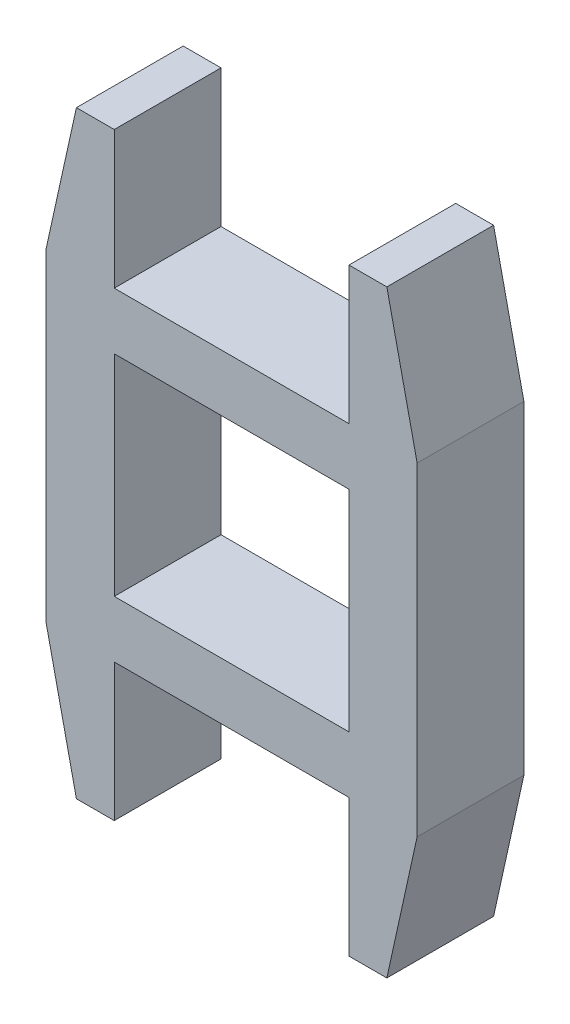
ISO-10303-21;
HEADER;
FILE_DESCRIPTION(('STEP AP214'),'2;1');
FILE_NAME('part.step','',(''),(''),'','','');
FILE_SCHEMA(('AUTOMOTIVE_DESIGN { 1 0 10303 214 1 1 1 1 }'));
ENDSEC;
DATA;
#1=APPLICATION_CONTEXT('core data for automotive mechanical design processes');
#2=APPLICATION_PROTOCOL_DEFINITION('international standard','automotive_design',2000,#1);
#3=PRODUCT_CONTEXT('',#1,'mechanical');
#4=PRODUCT('Part','Part','',(#3));
#5=PRODUCT_RELATED_PRODUCT_CATEGORY('part','',(#4));
#6=PRODUCT_DEFINITION_FORMATION('','',#4);
#7=PRODUCT_DEFINITION_CONTEXT('part definition',#1,'design');
#8=PRODUCT_DEFINITION('design','',#6,#7);
#9=PRODUCT_DEFINITION_SHAPE('','',#8);
#10=(LENGTH_UNIT() NAMED_UNIT(*) SI_UNIT(.MILLI.,.METRE.));
#11=(NAMED_UNIT(*) PLANE_ANGLE_UNIT() SI_UNIT($,.RADIAN.));
#12=(NAMED_UNIT(*) SI_UNIT($,.STERADIAN.) SOLID_ANGLE_UNIT());
#13=UNCERTAINTY_MEASURE_WITH_UNIT(LENGTH_MEASURE(1.E-05),#10,'distance_accuracy_value','');
#14=(GEOMETRIC_REPRESENTATION_CONTEXT(3) GLOBAL_UNCERTAINTY_ASSIGNED_CONTEXT((#13)) GLOBAL_UNIT_ASSIGNED_CONTEXT((#10,
#11,#12)) REPRESENTATION_CONTEXT('',''));
#15=CARTESIAN_POINT('',(0.,0.,0.));
#16=DIRECTION('',(0.,0.,1.));
#17=DIRECTION('',(1.,0.,0.));
#18=AXIS2_PLACEMENT_3D('',#15,#16,#17);
#19=CARTESIAN_POINT('',(1247.20962355286,947.327195660845,5.64));
#20=DIRECTION('',(0.,0.,1.));
#21=DIRECTION('',(1.,0.,0.));
#22=AXIS2_PLACEMENT_3D('',#19,#20,#21);
#23=PLANE('',#22);
#24=DIRECTION('',(0.,1.,0.));
#25=VECTOR('',#24,1.);
#26=CARTESIAN_POINT('',(1247.20962355286,940.068029887523,5.64));
#27=LINE('',#26,#25);
#28=CARTESIAN_POINT('',(1247.20962355286,940.068029887523,5.64));
#29=VERTEX_POINT('',#28);
#30=CARTESIAN_POINT('',(1247.20962355286,947.327195660845,5.64));
#31=VERTEX_POINT('',#30);
#32=EDGE_CURVE('E206',#29,#31,#27,.T.);
#33=ORIENTED_EDGE('',*,*,#32,.T.);
#34=DIRECTION('',(1.,0.,0.));
#35=VECTOR('',#34,1.);
#36=CARTESIAN_POINT('',(1259.60962355286,947.327195660845,5.64));
#37=LINE('',#36,#35);
#38=CARTESIAN_POINT('',(1259.60962355286,947.327195660845,5.64));
#39=VERTEX_POINT('',#38);
#40=EDGE_CURVE('E209',#31,#39,#37,.T.);
#41=ORIENTED_EDGE('',*,*,#40,.T.);
#42=DIRECTION('',(0.,-1.,0.));
#43=VECTOR('',#42,1.);
#44=CARTESIAN_POINT('',(1259.60962355286,940.068029887523,5.64));
#45=LINE('',#44,#43);
#46=CARTESIAN_POINT('',(1259.60962355286,940.068029887523,5.64));
#47=VERTEX_POINT('',#46);
#48=EDGE_CURVE('E212',#39,#47,#45,.T.);
#49=ORIENTED_EDGE('',*,*,#48,.T.);
#50=DIRECTION('',(1.,0.,0.));
#51=VECTOR('',#50,1.);
#52=CARTESIAN_POINT('',(1261.60962355286,940.068029887523,5.64));
#53=LINE('',#52,#51);
#54=CARTESIAN_POINT('',(1261.60962355286,940.068029887523,5.64));
#55=VERTEX_POINT('',#54);
#56=EDGE_CURVE('E214',#47,#55,#53,.T.);
#57=ORIENTED_EDGE('',*,*,#56,.T.);
#58=DIRECTION('',(0.215244604723381,0.976560167187601,0.));
#59=VECTOR('',#58,1.);
#60=CARTESIAN_POINT('',(1263.20962355286,947.327195660845,5.64));
#61=LINE('',#60,#59);
#62=CARTESIAN_POINT('',(1263.20962355286,947.327195660845,5.64));
#63=VERTEX_POINT('',#62);
#64=EDGE_CURVE('E216',#55,#63,#61,.T.);
#65=ORIENTED_EDGE('',*,*,#64,.T.);
#66=DIRECTION('',(0.,1.,0.));
#67=VECTOR('',#66,1.);
#68=CARTESIAN_POINT('',(1263.20962355286,964.427195660845,5.64));
#69=LINE('',#68,#67);
#70=CARTESIAN_POINT('',(1263.20962355286,964.427195660845,5.64));
#71=VERTEX_POINT('',#70);
#72=EDGE_CURVE('E218',#63,#71,#69,.T.);
#73=ORIENTED_EDGE('',*,*,#72,.T.);
#74=DIRECTION('',(-0.215244604723381,0.976560167187601,0.));
#75=VECTOR('',#74,1.);
#76=CARTESIAN_POINT('',(1263.20962355286,964.427195660845,5.64));
#77=LINE('',#76,#75);
#78=CARTESIAN_POINT('',(1261.60962355286,971.686361434167,5.64));
#79=VERTEX_POINT('',#78);
#80=EDGE_CURVE('E220',#71,#79,#77,.T.);
#81=ORIENTED_EDGE('',*,*,#80,.T.);
#82=DIRECTION('',(-1.,0.,0.));
#83=VECTOR('',#82,1.);
#84=CARTESIAN_POINT('',(1261.60962355286,971.686361434167,5.64));
#85=LINE('',#84,#83);
#86=CARTESIAN_POINT('',(1259.60962355286,971.686361434167,5.64));
#87=VERTEX_POINT('',#86);
#88=EDGE_CURVE('E222',#79,#87,#85,.T.);
#89=ORIENTED_EDGE('',*,*,#88,.T.);
#90=DIRECTION('',(0.,-1.,0.));
#91=VECTOR('',#90,1.);
#92=CARTESIAN_POINT('',(1259.60962355286,971.686361434167,5.64));
#93=LINE('',#92,#91);
#94=CARTESIAN_POINT('',(1259.60962355286,964.427195660845,5.64));
#95=VERTEX_POINT('',#94);
#96=EDGE_CURVE('E224',#87,#95,#93,.T.);
#97=ORIENTED_EDGE('',*,*,#96,.T.);
#98=DIRECTION('',(-1.,0.,0.));
#99=VECTOR('',#98,1.);
#100=CARTESIAN_POINT('',(1259.60962355286,964.427195660845,5.64));
#101=LINE('',#100,#99);
#102=CARTESIAN_POINT('',(1247.20962355286,964.427195660845,5.64));
#103=VERTEX_POINT('',#102);
#104=EDGE_CURVE('E226',#95,#103,#101,.T.);
#105=ORIENTED_EDGE('',*,*,#104,.T.);
#106=DIRECTION('',(0.,1.,0.));
#107=VECTOR('',#106,1.);
#108=CARTESIAN_POINT('',(1247.20962355286,971.686361434167,5.64));
#109=LINE('',#108,#107);
#110=CARTESIAN_POINT('',(1247.20962355286,971.686361434167,5.64));
#111=VERTEX_POINT('',#110);
#112=EDGE_CURVE('E228',#103,#111,#109,.T.);
#113=ORIENTED_EDGE('',*,*,#112,.T.);
#114=DIRECTION('',(-1.,0.,0.));
#115=VECTOR('',#114,1.);
#116=CARTESIAN_POINT('',(1245.20962355286,971.686361434167,5.64));
#117=LINE('',#116,#115);
#118=CARTESIAN_POINT('',(1245.20962355286,971.686361434167,5.64));
#119=VERTEX_POINT('',#118);
#120=EDGE_CURVE('E230',#111,#119,#117,.T.);
#121=ORIENTED_EDGE('',*,*,#120,.T.);
#122=DIRECTION('',(-0.215244604723381,-0.976560167187601,0.));
#123=VECTOR('',#122,1.);
#124=CARTESIAN_POINT('',(1243.60962355286,964.427195660845,5.64));
#125=LINE('',#124,#123);
#126=CARTESIAN_POINT('',(1243.60962355286,964.427195660845,5.64));
#127=VERTEX_POINT('',#126);
#128=EDGE_CURVE('E232',#119,#127,#125,.T.);
#129=ORIENTED_EDGE('',*,*,#128,.T.);
#130=DIRECTION('',(0.,-1.,0.));
#131=VECTOR('',#130,1.);
#132=CARTESIAN_POINT('',(1243.60962355286,964.427195660845,5.64));
#133=LINE('',#132,#131);
#134=CARTESIAN_POINT('',(1243.60962355286,947.327195660845,5.64));
#135=VERTEX_POINT('',#134);
#136=EDGE_CURVE('E234',#127,#135,#133,.T.);
#137=ORIENTED_EDGE('',*,*,#136,.T.);
#138=DIRECTION('',(0.215244604723381,-0.976560167187601,0.));
#139=VECTOR('',#138,1.);
#140=CARTESIAN_POINT('',(1243.60962355286,947.327195660845,5.64));
#141=LINE('',#140,#139);
#142=CARTESIAN_POINT('',(1245.20962355286,940.068029887523,5.64));
#143=VERTEX_POINT('',#142);
#144=EDGE_CURVE('E236',#135,#143,#141,.T.);
#145=ORIENTED_EDGE('',*,*,#144,.T.);
#146=DIRECTION('',(1.,0.,0.));
#147=VECTOR('',#146,1.);
#148=CARTESIAN_POINT('',(1245.20962355286,940.068029887523,5.64));
#149=LINE('',#148,#147);
#150=EDGE_CURVE('E238',#143,#29,#149,.T.);
#151=ORIENTED_EDGE('',*,*,#150,.T.);
#152=EDGE_LOOP('',(#33,#41,#49,#57,#65,#73,#81,#89,#97,#105,#113,#121,#129,#137,#145,#151));
#153=FACE_BOUND('',#152,.T.);
#154=DIRECTION('',(-1.,0.,0.));
#155=VECTOR('',#154,1.);
#156=CARTESIAN_POINT('',(1247.20962355286,961.427195660845,5.64));
#157=LINE('',#156,#155);
#158=CARTESIAN_POINT('',(1259.60962355286,961.427195660845,5.64));
#159=VERTEX_POINT('',#158);
#160=CARTESIAN_POINT('',(1247.20962355286,961.427195660845,5.64));
#161=VERTEX_POINT('',#160);
#162=EDGE_CURVE('E178',#159,#161,#157,.T.);
#163=ORIENTED_EDGE('',*,*,#162,.F.);
#164=DIRECTION('',(0.,1.,0.));
#165=VECTOR('',#164,1.);
#166=CARTESIAN_POINT('',(1259.60962355286,961.427195660845,5.64));
#167=LINE('',#166,#165);
#168=CARTESIAN_POINT('',(1259.60962355286,950.327195660845,5.64));
#169=VERTEX_POINT('',#168);
#170=EDGE_CURVE('E170',#169,#159,#167,.T.);
#171=ORIENTED_EDGE('',*,*,#170,.F.);
#172=DIRECTION('',(1.,0.,0.));
#173=VECTOR('',#172,1.);
#174=CARTESIAN_POINT('',(1247.20962355286,950.327195660845,5.64));
#175=LINE('',#174,#173);
#176=CARTESIAN_POINT('',(1247.20962355286,950.327195660845,5.64));
#177=VERTEX_POINT('',#176);
#178=EDGE_CURVE('E192',#177,#169,#175,.T.);
#179=ORIENTED_EDGE('',*,*,#178,.F.);
#180=DIRECTION('',(0.,-1.,0.));
#181=VECTOR('',#180,1.);
#182=CARTESIAN_POINT('',(1247.20962355286,961.427195660845,5.64));
#183=LINE('',#182,#181);
#184=EDGE_CURVE('E190',#161,#177,#183,.T.);
#185=ORIENTED_EDGE('',*,*,#184,.F.);
#186=EDGE_LOOP('',(#163,#171,#179,#185));
#187=FACE_BOUND('',#186,.T.);
#188=ADVANCED_FACE('F33',(#153,#187),#23,.T.);
#189=CARTESIAN_POINT('',(1247.20962355286,947.327195660845,0.));
#190=DIRECTION('',(0.,0.,1.));
#191=DIRECTION('',(1.,0.,0.));
#192=AXIS2_PLACEMENT_3D('',#189,#190,#191);
#193=PLANE('',#192);
#194=DIRECTION('',(0.,1.,0.));
#195=VECTOR('',#194,1.);
#196=CARTESIAN_POINT('',(1247.20962355286,940.068029887523,0.));
#197=LINE('',#196,#195);
#198=CARTESIAN_POINT('',(1247.20962355286,940.068029887523,0.));
#199=VERTEX_POINT('',#198);
#200=CARTESIAN_POINT('',(1247.20962355286,947.327195660845,0.));
#201=VERTEX_POINT('',#200);
#202=EDGE_CURVE('E186',#199,#201,#197,.T.);
#203=ORIENTED_EDGE('',*,*,#202,.F.);
#204=DIRECTION('',(1.,0.,0.));
#205=VECTOR('',#204,1.);
#206=CARTESIAN_POINT('',(1245.20962355286,940.068029887523,0.));
#207=LINE('',#206,#205);
#208=CARTESIAN_POINT('',(1245.20962355286,940.068029887523,0.));
#209=VERTEX_POINT('',#208);
#210=EDGE_CURVE('E210',#209,#199,#207,.T.);
#211=ORIENTED_EDGE('',*,*,#210,.F.);
#212=DIRECTION('',(0.215244604723381,-0.976560167187601,0.));
#213=VECTOR('',#212,1.);
#214=CARTESIAN_POINT('',(1243.60962355286,947.327195660845,0.));
#215=LINE('',#214,#213);
#216=CARTESIAN_POINT('',(1243.60962355286,947.327195660845,0.));
#217=VERTEX_POINT('',#216);
#218=EDGE_CURVE('E269',#217,#209,#215,.T.);
#219=ORIENTED_EDGE('',*,*,#218,.F.);
#220=DIRECTION('',(0.,-1.,0.));
#221=VECTOR('',#220,1.);
#222=CARTESIAN_POINT('',(1243.60962355286,964.427195660845,0.));
#223=LINE('',#222,#221);
#224=CARTESIAN_POINT('',(1243.60962355286,964.427195660845,0.));
#225=VERTEX_POINT('',#224);
#226=EDGE_CURVE('E267',#225,#217,#223,.T.);
#227=ORIENTED_EDGE('',*,*,#226,.F.);
#228=DIRECTION('',(-0.215244604723381,-0.976560167187601,0.));
#229=VECTOR('',#228,1.);
#230=CARTESIAN_POINT('',(1243.60962355286,964.427195660845,0.));
#231=LINE('',#230,#229);
#232=CARTESIAN_POINT('',(1245.20962355286,971.686361434167,0.));
#233=VERTEX_POINT('',#232);
#234=EDGE_CURVE('E265',#233,#225,#231,.T.);
#235=ORIENTED_EDGE('',*,*,#234,.F.);
#236=DIRECTION('',(-1.,0.,0.));
#237=VECTOR('',#236,1.);
#238=CARTESIAN_POINT('',(1245.20962355286,971.686361434167,0.));
#239=LINE('',#238,#237);
#240=CARTESIAN_POINT('',(1247.20962355286,971.686361434167,0.));
#241=VERTEX_POINT('',#240);
#242=EDGE_CURVE('E263',#241,#233,#239,.T.);
#243=ORIENTED_EDGE('',*,*,#242,.F.);
#244=DIRECTION('',(0.,1.,0.));
#245=VECTOR('',#244,1.);
#246=CARTESIAN_POINT('',(1247.20962355286,971.686361434167,0.));
#247=LINE('',#246,#245);
#248=CARTESIAN_POINT('',(1247.20962355286,964.427195660845,0.));
#249=VERTEX_POINT('',#248);
#250=EDGE_CURVE('E261',#249,#241,#247,.T.);
#251=ORIENTED_EDGE('',*,*,#250,.F.);
#252=DIRECTION('',(-1.,0.,0.));
#253=VECTOR('',#252,1.);
#254=CARTESIAN_POINT('',(1259.60962355286,964.427195660845,0.));
#255=LINE('',#254,#253);
#256=CARTESIAN_POINT('',(1259.60962355286,964.427195660845,0.));
#257=VERTEX_POINT('',#256);
#258=EDGE_CURVE('E259',#257,#249,#255,.T.);
#259=ORIENTED_EDGE('',*,*,#258,.F.);
#260=DIRECTION('',(0.,-1.,0.));
#261=VECTOR('',#260,1.);
#262=CARTESIAN_POINT('',(1259.60962355286,971.686361434167,0.));
#263=LINE('',#262,#261);
#264=CARTESIAN_POINT('',(1259.60962355286,971.686361434167,0.));
#265=VERTEX_POINT('',#264);
#266=EDGE_CURVE('E257',#265,#257,#263,.T.);
#267=ORIENTED_EDGE('',*,*,#266,.F.);
#268=DIRECTION('',(-1.,0.,0.));
#269=VECTOR('',#268,1.);
#270=CARTESIAN_POINT('',(1261.60962355286,971.686361434167,0.));
#271=LINE('',#270,#269);
#272=CARTESIAN_POINT('',(1261.60962355286,971.686361434167,0.));
#273=VERTEX_POINT('',#272);
#274=EDGE_CURVE('E255',#273,#265,#271,.T.);
#275=ORIENTED_EDGE('',*,*,#274,.F.);
#276=DIRECTION('',(-0.215244604723381,0.976560167187601,0.));
#277=VECTOR('',#276,1.);
#278=CARTESIAN_POINT('',(1263.20962355286,964.427195660845,0.));
#279=LINE('',#278,#277);
#280=CARTESIAN_POINT('',(1263.20962355286,964.427195660845,0.));
#281=VERTEX_POINT('',#280);
#282=EDGE_CURVE('E253',#281,#273,#279,.T.);
#283=ORIENTED_EDGE('',*,*,#282,.F.);
#284=DIRECTION('',(0.,1.,0.));
#285=VECTOR('',#284,1.);
#286=CARTESIAN_POINT('',(1263.20962355286,964.427195660845,0.));
#287=LINE('',#286,#285);
#288=CARTESIAN_POINT('',(1263.20962355286,947.327195660845,0.));
#289=VERTEX_POINT('',#288);
#290=EDGE_CURVE('E251',#289,#281,#287,.T.);
#291=ORIENTED_EDGE('',*,*,#290,.F.);
#292=DIRECTION('',(0.215244604723381,0.976560167187601,0.));
#293=VECTOR('',#292,1.);
#294=CARTESIAN_POINT('',(1263.20962355286,947.327195660845,0.));
#295=LINE('',#294,#293);
#296=CARTESIAN_POINT('',(1261.60962355286,940.068029887523,0.));
#297=VERTEX_POINT('',#296);
#298=EDGE_CURVE('E249',#297,#289,#295,.T.);
#299=ORIENTED_EDGE('',*,*,#298,.F.);
#300=DIRECTION('',(1.,0.,0.));
#301=VECTOR('',#300,1.);
#302=CARTESIAN_POINT('',(1261.60962355286,940.068029887523,0.));
#303=LINE('',#302,#301);
#304=CARTESIAN_POINT('',(1259.60962355286,940.068029887523,0.));
#305=VERTEX_POINT('',#304);
#306=EDGE_CURVE('E247',#305,#297,#303,.T.);
#307=ORIENTED_EDGE('',*,*,#306,.F.);
#308=DIRECTION('',(0.,-1.,0.));
#309=VECTOR('',#308,1.);
#310=CARTESIAN_POINT('',(1259.60962355286,940.068029887523,0.));
#311=LINE('',#310,#309);
#312=CARTESIAN_POINT('',(1259.60962355286,947.327195660845,0.));
#313=VERTEX_POINT('',#312);
#314=EDGE_CURVE('E245',#313,#305,#311,.T.);
#315=ORIENTED_EDGE('',*,*,#314,.F.);
#316=DIRECTION('',(1.,0.,0.));
#317=VECTOR('',#316,1.);
#318=CARTESIAN_POINT('',(1259.60962355286,947.327195660845,0.));
#319=LINE('',#318,#317);
#320=EDGE_CURVE('E243',#201,#313,#319,.T.);
#321=ORIENTED_EDGE('',*,*,#320,.F.);
#322=EDGE_LOOP('',(#203,#211,#219,#227,#235,#243,#251,#259,#267,#275,#283,#291,#299,#307,#315,#321));
#323=FACE_BOUND('',#322,.T.);
#324=DIRECTION('',(0.,1.,0.));
#325=VECTOR('',#324,1.);
#326=CARTESIAN_POINT('',(1259.60962355286,961.427195660845,0.));
#327=LINE('',#326,#325);
#328=CARTESIAN_POINT('',(1259.60962355286,950.327195660845,0.));
#329=VERTEX_POINT('',#328);
#330=CARTESIAN_POINT('',(1259.60962355286,961.427195660845,0.));
#331=VERTEX_POINT('',#330);
#332=EDGE_CURVE('E56',#329,#331,#327,.T.);
#333=ORIENTED_EDGE('',*,*,#332,.T.);
#334=DIRECTION('',(-1.,0.,0.));
#335=VECTOR('',#334,1.);
#336=CARTESIAN_POINT('',(1247.20962355286,961.427195660845,0.));
#337=LINE('',#336,#335);
#338=CARTESIAN_POINT('',(1247.20962355286,961.427195660845,0.));
#339=VERTEX_POINT('',#338);
#340=EDGE_CURVE('E185',#331,#339,#337,.T.);
#341=ORIENTED_EDGE('',*,*,#340,.T.);
#342=DIRECTION('',(0.,-1.,0.));
#343=VECTOR('',#342,1.);
#344=CARTESIAN_POINT('',(1247.20962355286,961.427195660845,0.));
#345=LINE('',#344,#343);
#346=CARTESIAN_POINT('',(1247.20962355286,950.327195660845,0.));
#347=VERTEX_POINT('',#346);
#348=EDGE_CURVE('E198',#339,#347,#345,.T.);
#349=ORIENTED_EDGE('',*,*,#348,.T.);
#350=DIRECTION('',(1.,0.,0.));
#351=VECTOR('',#350,1.);
#352=CARTESIAN_POINT('',(1247.20962355286,950.327195660845,0.));
#353=LINE('',#352,#351);
#354=EDGE_CURVE('E179',#347,#329,#353,.T.);
#355=ORIENTED_EDGE('',*,*,#354,.T.);
#356=EDGE_LOOP('',(#333,#341,#349,#355));
#357=FACE_BOUND('',#356,.T.);
#358=ADVANCED_FACE('F323',(#323,#357),#193,.F.);
#359=CARTESIAN_POINT('',(1247.20962355286,940.068029887523,5.64));
#360=DIRECTION('',(-1.,0.,0.));
#361=DIRECTION('',(0.,0.,1.));
#362=AXIS2_PLACEMENT_3D('',#359,#360,#361);
#363=PLANE('',#362);
#364=ORIENTED_EDGE('',*,*,#202,.T.);
#365=DIRECTION('',(0.,0.,-1.));
#366=VECTOR('',#365,1.);
#367=CARTESIAN_POINT('',(1247.20962355286,947.327195660845,5.64));
#368=LINE('',#367,#366);
#369=EDGE_CURVE('E11',#31,#201,#368,.T.);
#370=ORIENTED_EDGE('',*,*,#369,.F.);
#371=ORIENTED_EDGE('',*,*,#32,.F.);
#372=DIRECTION('',(0.,0.,-1.));
#373=VECTOR('',#372,1.);
#374=CARTESIAN_POINT('',(1247.20962355286,940.068029887523,5.64));
#375=LINE('',#374,#373);
#376=EDGE_CURVE('E240',#29,#199,#375,.T.);
#377=ORIENTED_EDGE('',*,*,#376,.T.);
#378=EDGE_LOOP('',(#364,#370,#371,#377));
#379=FACE_BOUND('',#378,.T.);
#380=ADVANCED_FACE('F35',(#379),#363,.F.);
#381=CARTESIAN_POINT('',(1259.60962355286,947.327195660845,5.64));
#382=DIRECTION('',(0.,1.,0.));
#383=DIRECTION('',(0.,0.,1.));
#384=AXIS2_PLACEMENT_3D('',#381,#382,#383);
#385=PLANE('',#384);
#386=ORIENTED_EDGE('',*,*,#320,.T.);
#387=DIRECTION('',(0.,0.,-1.));
#388=VECTOR('',#387,1.);
#389=CARTESIAN_POINT('',(1259.60962355286,947.327195660845,5.64));
#390=LINE('',#389,#388);
#391=EDGE_CURVE('E41',#39,#313,#390,.T.);
#392=ORIENTED_EDGE('',*,*,#391,.F.);
#393=ORIENTED_EDGE('',*,*,#40,.F.);
#394=ORIENTED_EDGE('',*,*,#369,.T.);
#395=EDGE_LOOP('',(#386,#392,#393,#394));
#396=FACE_BOUND('',#395,.T.);
#397=ADVANCED_FACE('F340',(#396),#385,.F.);
#398=CARTESIAN_POINT('',(1259.60962355286,940.068029887523,5.64));
#399=DIRECTION('',(1.,0.,0.));
#400=DIRECTION('',(0.,0.,-1.));
#401=AXIS2_PLACEMENT_3D('',#398,#399,#400);
#402=PLANE('',#401);
#403=ORIENTED_EDGE('',*,*,#314,.T.);
#404=DIRECTION('',(0.,0.,-1.));
#405=VECTOR('',#404,1.);
#406=CARTESIAN_POINT('',(1259.60962355286,940.068029887523,5.64));
#407=LINE('',#406,#405);
#408=EDGE_CURVE('E310',#47,#305,#407,.T.);
#409=ORIENTED_EDGE('',*,*,#408,.F.);
#410=ORIENTED_EDGE('',*,*,#48,.F.);
#411=ORIENTED_EDGE('',*,*,#391,.T.);
#412=EDGE_LOOP('',(#403,#409,#410,#411));
#413=FACE_BOUND('',#412,.T.);
#414=ADVANCED_FACE('F317',(#413),#402,.F.);
#415=CARTESIAN_POINT('',(1261.60962355286,940.068029887523,5.64));
#416=DIRECTION('',(0.,1.,0.));
#417=DIRECTION('',(0.,0.,1.));
#418=AXIS2_PLACEMENT_3D('',#415,#416,#417);
#419=PLANE('',#418);
#420=ORIENTED_EDGE('',*,*,#306,.T.);
#421=DIRECTION('',(0.,0.,-1.));
#422=VECTOR('',#421,1.);
#423=CARTESIAN_POINT('',(1261.60962355286,940.068029887523,5.64));
#424=LINE('',#423,#422);
#425=EDGE_CURVE('E307',#55,#297,#424,.T.);
#426=ORIENTED_EDGE('',*,*,#425,.F.);
#427=ORIENTED_EDGE('',*,*,#56,.F.);
#428=ORIENTED_EDGE('',*,*,#408,.T.);
#429=EDGE_LOOP('',(#420,#426,#427,#428));
#430=FACE_BOUND('',#429,.T.);
#431=ADVANCED_FACE('F329',(#430),#419,.F.);
#432=CARTESIAN_POINT('',(1263.20962355286,947.327195660845,5.64));
#433=DIRECTION('',(-0.976560167187601,0.215244604723381,0.));
#434=DIRECTION('',(-0.215244604723381,-0.976560167187601,0.));
#435=AXIS2_PLACEMENT_3D('',#432,#433,#434);
#436=PLANE('',#435);
#437=ORIENTED_EDGE('',*,*,#298,.T.);
#438=DIRECTION('',(0.,0.,-1.));
#439=VECTOR('',#438,1.);
#440=CARTESIAN_POINT('',(1263.20962355286,947.327195660845,5.64));
#441=LINE('',#440,#439);
#442=EDGE_CURVE('E304',#63,#289,#441,.T.);
#443=ORIENTED_EDGE('',*,*,#442,.F.);
#444=ORIENTED_EDGE('',*,*,#64,.F.);
#445=ORIENTED_EDGE('',*,*,#425,.T.);
#446=EDGE_LOOP('',(#437,#443,#444,#445));
#447=FACE_BOUND('',#446,.T.);
#448=ADVANCED_FACE('F333',(#447),#436,.F.);
#449=CARTESIAN_POINT('',(1263.20962355286,964.427195660845,5.64));
#450=DIRECTION('',(-1.,0.,0.));
#451=DIRECTION('',(0.,-1.,0.));
#452=AXIS2_PLACEMENT_3D('',#449,#450,#451);
#453=PLANE('',#452);
#454=ORIENTED_EDGE('',*,*,#290,.T.);
#455=DIRECTION('',(0.,0.,-1.));
#456=VECTOR('',#455,1.);
#457=CARTESIAN_POINT('',(1263.20962355286,964.427195660845,5.64));
#458=LINE('',#457,#456);
#459=EDGE_CURVE('E301',#71,#281,#458,.T.);
#460=ORIENTED_EDGE('',*,*,#459,.F.);
#461=ORIENTED_EDGE('',*,*,#72,.F.);
#462=ORIENTED_EDGE('',*,*,#442,.T.);
#463=EDGE_LOOP('',(#454,#460,#461,#462));
#464=FACE_BOUND('',#463,.T.);
#465=ADVANCED_FACE('F393',(#464),#453,.F.);
#466=CARTESIAN_POINT('',(1263.20962355286,964.427195660845,5.64));
#467=DIRECTION('',(-0.976560167187601,-0.215244604723381,0.));
#468=DIRECTION('',(0.215244604723381,-0.976560167187601,0.));
#469=AXIS2_PLACEMENT_3D('',#466,#467,#468);
#470=PLANE('',#469);
#471=ORIENTED_EDGE('',*,*,#282,.T.);
#472=DIRECTION('',(0.,0.,-1.));
#473=VECTOR('',#472,1.);
#474=CARTESIAN_POINT('',(1261.60962355286,971.686361434167,5.64));
#475=LINE('',#474,#473);
#476=EDGE_CURVE('E298',#79,#273,#475,.T.);
#477=ORIENTED_EDGE('',*,*,#476,.F.);
#478=ORIENTED_EDGE('',*,*,#80,.F.);
#479=ORIENTED_EDGE('',*,*,#459,.T.);
#480=EDGE_LOOP('',(#471,#477,#478,#479));
#481=FACE_BOUND('',#480,.T.);
#482=ADVANCED_FACE('F390',(#481),#470,.F.);
#483=CARTESIAN_POINT('',(1261.60962355286,971.686361434167,5.64));
#484=DIRECTION('',(0.,-1.,0.));
#485=DIRECTION('',(0.,0.,-1.));
#486=AXIS2_PLACEMENT_3D('',#483,#484,#485);
#487=PLANE('',#486);
#488=ORIENTED_EDGE('',*,*,#274,.T.);
#489=DIRECTION('',(0.,0.,-1.));
#490=VECTOR('',#489,1.);
#491=CARTESIAN_POINT('',(1259.60962355286,971.686361434167,5.64));
#492=LINE('',#491,#490);
#493=EDGE_CURVE('E295',#87,#265,#492,.T.);
#494=ORIENTED_EDGE('',*,*,#493,.F.);
#495=ORIENTED_EDGE('',*,*,#88,.F.);
#496=ORIENTED_EDGE('',*,*,#476,.T.);
#497=EDGE_LOOP('',(#488,#494,#495,#496));
#498=FACE_BOUND('',#497,.T.);
#499=ADVANCED_FACE('F386',(#498),#487,.F.);
#500=CARTESIAN_POINT('',(1259.60962355286,971.686361434167,5.64));
#501=DIRECTION('',(1.,0.,0.));
#502=DIRECTION('',(0.,0.,-1.));
#503=AXIS2_PLACEMENT_3D('',#500,#501,#502);
#504=PLANE('',#503);
#505=ORIENTED_EDGE('',*,*,#266,.T.);
#506=DIRECTION('',(0.,0.,-1.));
#507=VECTOR('',#506,1.);
#508=CARTESIAN_POINT('',(1259.60962355286,964.427195660845,5.64));
#509=LINE('',#508,#507);
#510=EDGE_CURVE('E292',#95,#257,#509,.T.);
#511=ORIENTED_EDGE('',*,*,#510,.F.);
#512=ORIENTED_EDGE('',*,*,#96,.F.);
#513=ORIENTED_EDGE('',*,*,#493,.T.);
#514=EDGE_LOOP('',(#505,#511,#512,#513));
#515=FACE_BOUND('',#514,.T.);
#516=ADVANCED_FACE('F382',(#515),#504,.F.);
#517=CARTESIAN_POINT('',(1259.60962355286,964.427195660845,5.64));
#518=DIRECTION('',(0.,-1.,0.));
#519=DIRECTION('',(0.,0.,-1.));
#520=AXIS2_PLACEMENT_3D('',#517,#518,#519);
#521=PLANE('',#520);
#522=ORIENTED_EDGE('',*,*,#258,.T.);
#523=DIRECTION('',(0.,0.,-1.));
#524=VECTOR('',#523,1.);
#525=CARTESIAN_POINT('',(1247.20962355286,964.427195660845,5.64));
#526=LINE('',#525,#524);
#527=EDGE_CURVE('E289',#103,#249,#526,.T.);
#528=ORIENTED_EDGE('',*,*,#527,.F.);
#529=ORIENTED_EDGE('',*,*,#104,.F.);
#530=ORIENTED_EDGE('',*,*,#510,.T.);
#531=EDGE_LOOP('',(#522,#528,#529,#530));
#532=FACE_BOUND('',#531,.T.);
#533=ADVANCED_FACE('F377',(#532),#521,.F.);
#534=CARTESIAN_POINT('',(1247.20962355286,971.686361434167,5.64));
#535=DIRECTION('',(-1.,0.,0.));
#536=DIRECTION('',(0.,0.,1.));
#537=AXIS2_PLACEMENT_3D('',#534,#535,#536);
#538=PLANE('',#537);
#539=ORIENTED_EDGE('',*,*,#250,.T.);
#540=DIRECTION('',(0.,0.,-1.));
#541=VECTOR('',#540,1.);
#542=CARTESIAN_POINT('',(1247.20962355286,971.686361434167,5.64));
#543=LINE('',#542,#541);
#544=EDGE_CURVE('E286',#111,#241,#543,.T.);
#545=ORIENTED_EDGE('',*,*,#544,.F.);
#546=ORIENTED_EDGE('',*,*,#112,.F.);
#547=ORIENTED_EDGE('',*,*,#527,.T.);
#548=EDGE_LOOP('',(#539,#545,#546,#547));
#549=FACE_BOUND('',#548,.T.);
#550=ADVANCED_FACE('F371',(#549),#538,.F.);
#551=CARTESIAN_POINT('',(1245.20962355286,971.686361434167,5.64));
#552=DIRECTION('',(0.,-1.,0.));
#553=DIRECTION('',(0.,0.,-1.));
#554=AXIS2_PLACEMENT_3D('',#551,#552,#553);
#555=PLANE('',#554);
#556=ORIENTED_EDGE('',*,*,#242,.T.);
#557=DIRECTION('',(0.,0.,-1.));
#558=VECTOR('',#557,1.);
#559=CARTESIAN_POINT('',(1245.20962355286,971.686361434167,5.64));
#560=LINE('',#559,#558);
#561=EDGE_CURVE('E283',#119,#233,#560,.T.);
#562=ORIENTED_EDGE('',*,*,#561,.F.);
#563=ORIENTED_EDGE('',*,*,#120,.F.);
#564=ORIENTED_EDGE('',*,*,#544,.T.);
#565=EDGE_LOOP('',(#556,#562,#563,#564));
#566=FACE_BOUND('',#565,.T.);
#567=ADVANCED_FACE('F367',(#566),#555,.F.);
#568=CARTESIAN_POINT('',(1243.60962355286,964.427195660845,5.64));
#569=DIRECTION('',(0.976560167187601,-0.215244604723381,0.));
#570=DIRECTION('',(0.215244604723381,0.976560167187601,0.));
#571=AXIS2_PLACEMENT_3D('',#568,#569,#570);
#572=PLANE('',#571);
#573=ORIENTED_EDGE('',*,*,#234,.T.);
#574=DIRECTION('',(0.,0.,-1.));
#575=VECTOR('',#574,1.);
#576=CARTESIAN_POINT('',(1243.60962355286,964.427195660845,5.64));
#577=LINE('',#576,#575);
#578=EDGE_CURVE('E280',#127,#225,#577,.T.);
#579=ORIENTED_EDGE('',*,*,#578,.F.);
#580=ORIENTED_EDGE('',*,*,#128,.F.);
#581=ORIENTED_EDGE('',*,*,#561,.T.);
#582=EDGE_LOOP('',(#573,#579,#580,#581));
#583=FACE_BOUND('',#582,.T.);
#584=ADVANCED_FACE('F362',(#583),#572,.F.);
#585=CARTESIAN_POINT('',(1243.60962355286,964.427195660845,5.64));
#586=DIRECTION('',(1.,0.,0.));
#587=DIRECTION('',(0.,0.,-1.));
#588=AXIS2_PLACEMENT_3D('',#585,#586,#587);
#589=PLANE('',#588);
#590=ORIENTED_EDGE('',*,*,#226,.T.);
#591=DIRECTION('',(0.,0.,-1.));
#592=VECTOR('',#591,1.);
#593=CARTESIAN_POINT('',(1243.60962355286,947.327195660845,5.64));
#594=LINE('',#593,#592);
#595=EDGE_CURVE('E277',#135,#217,#594,.T.);
#596=ORIENTED_EDGE('',*,*,#595,.F.);
#597=ORIENTED_EDGE('',*,*,#136,.F.);
#598=ORIENTED_EDGE('',*,*,#578,.T.);
#599=EDGE_LOOP('',(#590,#596,#597,#598));
#600=FACE_BOUND('',#599,.T.);
#601=ADVANCED_FACE('F356',(#600),#589,.F.);
#602=CARTESIAN_POINT('',(1243.60962355286,947.327195660845,5.64));
#603=DIRECTION('',(0.976560167187601,0.215244604723381,0.));
#604=DIRECTION('',(-0.215244604723381,0.976560167187601,0.));
#605=AXIS2_PLACEMENT_3D('',#602,#603,#604);
#606=PLANE('',#605);
#607=ORIENTED_EDGE('',*,*,#218,.T.);
#608=DIRECTION('',(0.,0.,-1.));
#609=VECTOR('',#608,1.);
#610=CARTESIAN_POINT('',(1245.20962355286,940.068029887523,5.64));
#611=LINE('',#610,#609);
#612=EDGE_CURVE('E274',#143,#209,#611,.T.);
#613=ORIENTED_EDGE('',*,*,#612,.F.);
#614=ORIENTED_EDGE('',*,*,#144,.F.);
#615=ORIENTED_EDGE('',*,*,#595,.T.);
#616=EDGE_LOOP('',(#607,#613,#614,#615));
#617=FACE_BOUND('',#616,.T.);
#618=ADVANCED_FACE('F352',(#617),#606,.F.);
#619=CARTESIAN_POINT('',(1245.20962355286,940.068029887523,5.64));
#620=DIRECTION('',(0.,1.,0.));
#621=DIRECTION('',(0.,0.,1.));
#622=AXIS2_PLACEMENT_3D('',#619,#620,#621);
#623=PLANE('',#622);
#624=ORIENTED_EDGE('',*,*,#210,.T.);
#625=ORIENTED_EDGE('',*,*,#376,.F.);
#626=ORIENTED_EDGE('',*,*,#150,.F.);
#627=ORIENTED_EDGE('',*,*,#612,.T.);
#628=EDGE_LOOP('',(#624,#625,#626,#627));
#629=FACE_BOUND('',#628,.T.);
#630=ADVANCED_FACE('F347',(#629),#623,.F.);
#631=CARTESIAN_POINT('',(1259.60962355286,961.427195660845,5.64));
#632=DIRECTION('',(-1.,0.,0.));
#633=DIRECTION('',(0.,0.,1.));
#634=AXIS2_PLACEMENT_3D('',#631,#632,#633);
#635=PLANE('',#634);
#636=ORIENTED_EDGE('',*,*,#332,.F.);
#637=DIRECTION('',(0.,0.,-1.));
#638=VECTOR('',#637,1.);
#639=CARTESIAN_POINT('',(1259.60962355286,950.327195660845,5.64));
#640=LINE('',#639,#638);
#641=EDGE_CURVE('E174',#169,#329,#640,.T.);
#642=ORIENTED_EDGE('',*,*,#641,.F.);
#643=ORIENTED_EDGE('',*,*,#170,.T.);
#644=DIRECTION('',(0.,0.,-1.));
#645=VECTOR('',#644,1.);
#646=CARTESIAN_POINT('',(1259.60962355286,961.427195660845,5.64));
#647=LINE('',#646,#645);
#648=EDGE_CURVE('E173',#159,#331,#647,.T.);
#649=ORIENTED_EDGE('',*,*,#648,.T.);
#650=EDGE_LOOP('',(#636,#642,#643,#649));
#651=FACE_BOUND('',#650,.T.);
#652=ADVANCED_FACE('F172',(#651),#635,.T.);
#653=CARTESIAN_POINT('',(1247.20962355286,961.427195660845,5.64));
#654=DIRECTION('',(0.,-1.,0.));
#655=DIRECTION('',(0.,0.,-1.));
#656=AXIS2_PLACEMENT_3D('',#653,#654,#655);
#657=PLANE('',#656);
#658=ORIENTED_EDGE('',*,*,#340,.F.);
#659=ORIENTED_EDGE('',*,*,#648,.F.);
#660=ORIENTED_EDGE('',*,*,#162,.T.);
#661=DIRECTION('',(0.,0.,-1.));
#662=VECTOR('',#661,1.);
#663=CARTESIAN_POINT('',(1247.20962355286,961.427195660845,5.64));
#664=LINE('',#663,#662);
#665=EDGE_CURVE('E187',#161,#339,#664,.T.);
#666=ORIENTED_EDGE('',*,*,#665,.T.);
#667=EDGE_LOOP('',(#658,#659,#660,#666));
#668=FACE_BOUND('',#667,.T.);
#669=ADVANCED_FACE('F182',(#668),#657,.T.);
#670=CARTESIAN_POINT('',(1247.20962355286,961.427195660845,5.64));
#671=DIRECTION('',(1.,0.,0.));
#672=DIRECTION('',(0.,0.,-1.));
#673=AXIS2_PLACEMENT_3D('',#670,#671,#672);
#674=PLANE('',#673);
#675=ORIENTED_EDGE('',*,*,#348,.F.);
#676=ORIENTED_EDGE('',*,*,#665,.F.);
#677=ORIENTED_EDGE('',*,*,#184,.T.);
#678=DIRECTION('',(0.,0.,-1.));
#679=VECTOR('',#678,1.);
#680=CARTESIAN_POINT('',(1247.20962355286,950.327195660845,5.64));
#681=LINE('',#680,#679);
#682=EDGE_CURVE('E48',#177,#347,#681,.T.);
#683=ORIENTED_EDGE('',*,*,#682,.T.);
#684=EDGE_LOOP('',(#675,#676,#677,#683));
#685=FACE_BOUND('',#684,.T.);
#686=ADVANCED_FACE('F475',(#685),#674,.T.);
#687=CARTESIAN_POINT('',(1247.20962355286,950.327195660845,5.64));
#688=DIRECTION('',(0.,1.,0.));
#689=DIRECTION('',(0.,0.,1.));
#690=AXIS2_PLACEMENT_3D('',#687,#688,#689);
#691=PLANE('',#690);
#692=ORIENTED_EDGE('',*,*,#354,.F.);
#693=ORIENTED_EDGE('',*,*,#682,.F.);
#694=ORIENTED_EDGE('',*,*,#178,.T.);
#695=ORIENTED_EDGE('',*,*,#641,.T.);
#696=EDGE_LOOP('',(#692,#693,#694,#695));
#697=FACE_BOUND('',#696,.T.);
#698=ADVANCED_FACE('F481',(#697),#691,.T.);
#699=CLOSED_SHELL('',(#188,#358,#380,#397,#414,#431,#448,#465,#482,#499,#516,#533,#550,#567,
#584,#601,#618,#630,#652,#669,#686,#698));
#700=MANIFOLD_SOLID_BREP('B2',#699);
#701=ADVANCED_BREP_SHAPE_REPRESENTATION('',(#18,#700),#14);
#702=SHAPE_DEFINITION_REPRESENTATION(#9,#701);
ENDSEC;
END-ISO-10303-21;
